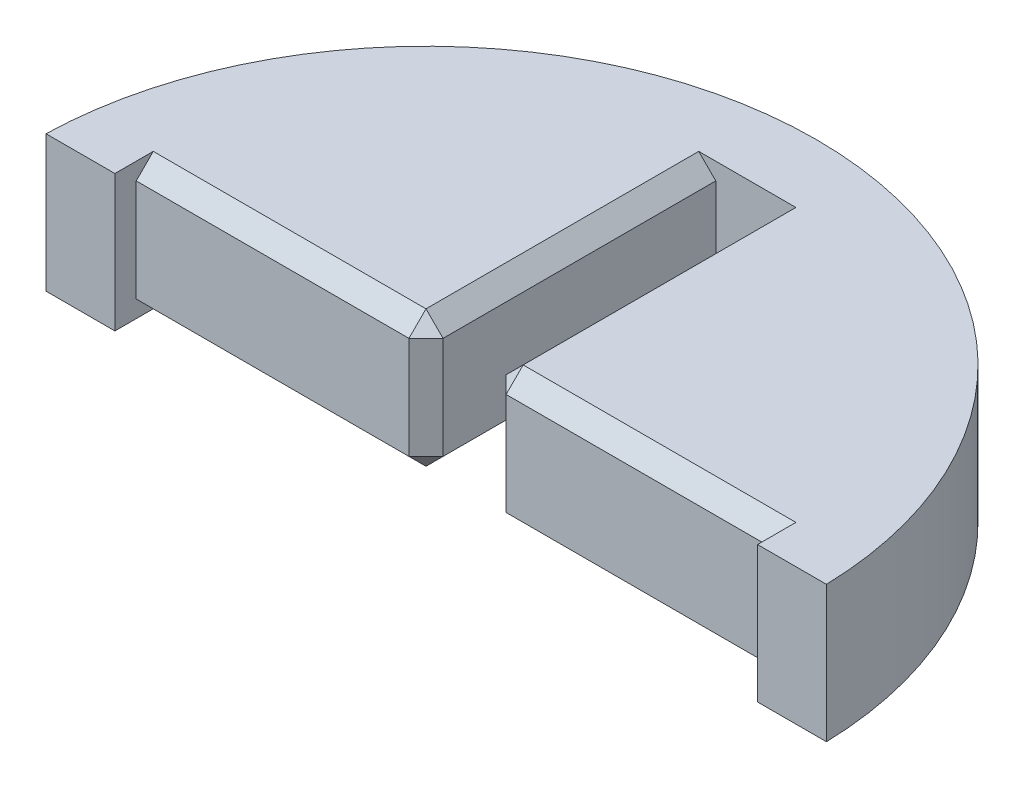
ISO-10303-21;
HEADER;
FILE_DESCRIPTION(('STEP AP214'),'2;1');
FILE_NAME('part.step','',(''),(''),'','','');
FILE_SCHEMA(('AUTOMOTIVE_DESIGN { 1 0 10303 214 1 1 1 1 }'));
ENDSEC;
DATA;
#1=APPLICATION_CONTEXT('core data for automotive mechanical design processes');
#2=APPLICATION_PROTOCOL_DEFINITION('international standard','automotive_design',2000,#1);
#3=PRODUCT_CONTEXT('',#1,'mechanical');
#4=PRODUCT('Part','Part','',(#3));
#5=PRODUCT_RELATED_PRODUCT_CATEGORY('part','',(#4));
#6=PRODUCT_DEFINITION_FORMATION('','',#4);
#7=PRODUCT_DEFINITION_CONTEXT('part definition',#1,'design');
#8=PRODUCT_DEFINITION('design','',#6,#7);
#9=PRODUCT_DEFINITION_SHAPE('','',#8);
#10=(LENGTH_UNIT() NAMED_UNIT(*) SI_UNIT(.MILLI.,.METRE.));
#11=(NAMED_UNIT(*) PLANE_ANGLE_UNIT() SI_UNIT($,.RADIAN.));
#12=(NAMED_UNIT(*) SI_UNIT($,.STERADIAN.) SOLID_ANGLE_UNIT());
#13=UNCERTAINTY_MEASURE_WITH_UNIT(LENGTH_MEASURE(1.E-05),#10,'distance_accuracy_value','');
#14=(GEOMETRIC_REPRESENTATION_CONTEXT(3) GLOBAL_UNCERTAINTY_ASSIGNED_CONTEXT((#13)) GLOBAL_UNIT_ASSIGNED_CONTEXT((#10,
#11,#12)) REPRESENTATION_CONTEXT('',''));
#15=CARTESIAN_POINT('',(0.,0.,0.));
#16=DIRECTION('',(0.,0.,1.));
#17=DIRECTION('',(1.,0.,0.));
#18=AXIS2_PLACEMENT_3D('',#15,#16,#17);
#19=CARTESIAN_POINT('',(-9.425,-1.,-0.299999999999999));
#20=DIRECTION('',(0.,0.,1.));
#21=DIRECTION('',(1.,0.,0.));
#22=AXIS2_PLACEMENT_3D('',#19,#20,#21);
#23=PLANE('',#22);
#24=DIRECTION('',(0.,1.,0.));
#25=VECTOR('',#24,1.);
#26=CARTESIAN_POINT('',(-9.425,-1.,-0.299999999999999));
#27=LINE('',#26,#25);
#28=CARTESIAN_POINT('',(-9.425,-1.,-0.299999999999999));
#29=VERTEX_POINT('',#28);
#30=CARTESIAN_POINT('',(-9.425,3.,-0.299999999999999));
#31=VERTEX_POINT('',#30);
#32=EDGE_CURVE('E212',#29,#31,#27,.T.);
#33=ORIENTED_EDGE('',*,*,#32,.T.);
#34=DIRECTION('',(1.,0.,0.));
#35=VECTOR('',#34,1.);
#36=CARTESIAN_POINT('',(-9.425,3.,-0.299999999999999));
#37=LINE('',#36,#35);
#38=CARTESIAN_POINT('',(-11.4461695884233,3.,-0.299999999999998));
#39=VERTEX_POINT('',#38);
#40=EDGE_CURVE('E185',#39,#31,#37,.T.);
#41=ORIENTED_EDGE('',*,*,#40,.F.);
#42=DIRECTION('',(0.,1.,0.));
#43=VECTOR('',#42,1.);
#44=CARTESIAN_POINT('',(-11.4461695884233,-1.,-0.299999999999998));
#45=LINE('',#44,#43);
#46=CARTESIAN_POINT('',(-11.4461695884233,-1.,-0.299999999999998));
#47=VERTEX_POINT('',#46);
#48=EDGE_CURVE('E176',#47,#39,#45,.T.);
#49=ORIENTED_EDGE('',*,*,#48,.F.);
#50=DIRECTION('',(1.,0.,0.));
#51=VECTOR('',#50,1.);
#52=CARTESIAN_POINT('',(-9.425,-1.,-0.299999999999999));
#53=LINE('',#52,#51);
#54=EDGE_CURVE('E191',#47,#29,#53,.T.);
#55=ORIENTED_EDGE('',*,*,#54,.T.);
#56=EDGE_LOOP('',(#33,#41,#49,#55));
#57=FACE_BOUND('',#56,.T.);
#58=ADVANCED_FACE('F37',(#57),#23,.T.);
#59=CARTESIAN_POINT('',(0.,-1.,0.));
#60=DIRECTION('',(0.,1.,0.));
#61=DIRECTION('',(0.,0.,1.));
#62=AXIS2_PLACEMENT_3D('',#59,#60,#61);
#63=CYLINDRICAL_SURFACE('',#62,11.4501003596888);
#64=ORIENTED_EDGE('',*,*,#48,.T.);
#65=CARTESIAN_POINT('',(0.,3.,0.));
#66=DIRECTION('',(0.,1.,0.));
#67=DIRECTION('',(0.,0.,1.));
#68=AXIS2_PLACEMENT_3D('',#65,#66,#67);
#69=CIRCLE('',#68,11.4501003596888);
#70=CARTESIAN_POINT('',(11.4461695884233,3.,-0.3));
#71=VERTEX_POINT('',#70);
#72=EDGE_CURVE('E180',#71,#39,#69,.T.);
#73=ORIENTED_EDGE('',*,*,#72,.F.);
#74=DIRECTION('',(0.,1.,0.));
#75=VECTOR('',#74,1.);
#76=CARTESIAN_POINT('',(11.4461695884233,-1.,-0.3));
#77=LINE('',#76,#75);
#78=CARTESIAN_POINT('',(11.4461695884233,-1.,-0.3));
#79=VERTEX_POINT('',#78);
#80=EDGE_CURVE('E165',#79,#71,#77,.T.);
#81=ORIENTED_EDGE('',*,*,#80,.F.);
#82=CARTESIAN_POINT('',(0.,-1.,0.));
#83=DIRECTION('',(0.,1.,0.));
#84=DIRECTION('',(0.,0.,-1.));
#85=AXIS2_PLACEMENT_3D('',#82,#83,#84);
#86=CIRCLE('',#85,11.4501003596888);
#87=EDGE_CURVE('E210',#79,#47,#86,.T.);
#88=ORIENTED_EDGE('',*,*,#87,.T.);
#89=EDGE_LOOP('',(#64,#73,#81,#88));
#90=FACE_BOUND('',#89,.T.);
#91=ADVANCED_FACE('F181',(#90),#63,.T.);
#92=CARTESIAN_POINT('',(9.425,-1.,-0.299999999999999));
#93=DIRECTION('',(0.,0.,1.));
#94=DIRECTION('',(1.,0.,0.));
#95=AXIS2_PLACEMENT_3D('',#92,#93,#94);
#96=PLANE('',#95);
#97=ORIENTED_EDGE('',*,*,#80,.T.);
#98=DIRECTION('',(1.,0.,0.));
#99=VECTOR('',#98,1.);
#100=CARTESIAN_POINT('',(9.425,3.,-0.299999999999999));
#101=LINE('',#100,#99);
#102=CARTESIAN_POINT('',(9.425,3.,-0.299999999999999));
#103=VERTEX_POINT('',#102);
#104=EDGE_CURVE('E169',#103,#71,#101,.T.);
#105=ORIENTED_EDGE('',*,*,#104,.F.);
#106=DIRECTION('',(0.,1.,0.));
#107=VECTOR('',#106,1.);
#108=CARTESIAN_POINT('',(9.425,-1.,-0.299999999999999));
#109=LINE('',#108,#107);
#110=CARTESIAN_POINT('',(9.425,-1.,-0.299999999999999));
#111=VERTEX_POINT('',#110);
#112=EDGE_CURVE('E177',#111,#103,#109,.T.);
#113=ORIENTED_EDGE('',*,*,#112,.F.);
#114=DIRECTION('',(1.,0.,0.));
#115=VECTOR('',#114,1.);
#116=CARTESIAN_POINT('',(9.425,-1.,-0.299999999999999));
#117=LINE('',#116,#115);
#118=EDGE_CURVE('E172',#111,#79,#117,.T.);
#119=ORIENTED_EDGE('',*,*,#118,.T.);
#120=EDGE_LOOP('',(#97,#105,#113,#119));
#121=FACE_BOUND('',#120,.T.);
#122=ADVANCED_FACE('F167',(#121),#96,.T.);
#123=CARTESIAN_POINT('',(9.425,-1.,-0.925000000000001));
#124=DIRECTION('',(-1.,0.,0.));
#125=DIRECTION('',(0.,0.,1.));
#126=AXIS2_PLACEMENT_3D('',#123,#124,#125);
#127=PLANE('',#126);
#128=ORIENTED_EDGE('',*,*,#112,.T.);
#129=DIRECTION('',(0.,0.,1.));
#130=VECTOR('',#129,1.);
#131=CARTESIAN_POINT('',(9.425,3.,-0.925000000000001));
#132=LINE('',#131,#130);
#133=CARTESIAN_POINT('',(9.425,3.,-1.425));
#134=VERTEX_POINT('',#133);
#135=EDGE_CURVE('E190',#134,#103,#132,.T.);
#136=ORIENTED_EDGE('',*,*,#135,.F.);
#137=DIRECTION('',(0.,0.707106781186548,-0.707106781186548));
#138=VECTOR('',#137,1.);
#139=CARTESIAN_POINT('',(9.425,3.,-1.425));
#140=LINE('',#139,#138);
#141=CARTESIAN_POINT('',(9.425,2.5,-0.925000000000001));
#142=VERTEX_POINT('',#141);
#143=EDGE_CURVE('E275',#134,#142,#140,.F.);
#144=ORIENTED_EDGE('',*,*,#143,.T.);
#145=DIRECTION('',(0.,1.,0.));
#146=VECTOR('',#145,1.);
#147=CARTESIAN_POINT('',(9.425,-1.,-0.925000000000001));
#148=LINE('',#147,#146);
#149=CARTESIAN_POINT('',(9.425,-0.499999999999996,-0.925000000000001));
#150=VERTEX_POINT('',#149);
#151=EDGE_CURVE('E216',#150,#142,#148,.T.);
#152=ORIENTED_EDGE('',*,*,#151,.F.);
#153=DIRECTION('',(0.,0.707106781186548,0.707106781186548));
#154=VECTOR('',#153,1.);
#155=CARTESIAN_POINT('',(9.425,-0.499999999999996,-0.925000000000001));
#156=LINE('',#155,#154);
#157=CARTESIAN_POINT('',(9.425,-1.,-1.425));
#158=VERTEX_POINT('',#157);
#159=EDGE_CURVE('E270',#150,#158,#156,.F.);
#160=ORIENTED_EDGE('',*,*,#159,.T.);
#161=DIRECTION('',(0.,0.,1.));
#162=VECTOR('',#161,1.);
#163=CARTESIAN_POINT('',(9.425,-1.,-0.925000000000001));
#164=LINE('',#163,#162);
#165=EDGE_CURVE('E206',#158,#111,#164,.T.);
#166=ORIENTED_EDGE('',*,*,#165,.T.);
#167=EDGE_LOOP('',(#128,#136,#144,#152,#160,#166));
#168=FACE_BOUND('',#167,.T.);
#169=ADVANCED_FACE('F542',(#168),#127,.T.);
#170=CARTESIAN_POINT('',(0.925000000000001,-1.,-0.925000000000001));
#171=DIRECTION('',(0.,0.,1.));
#172=DIRECTION('',(1.,0.,0.));
#173=AXIS2_PLACEMENT_3D('',#170,#171,#172);
#174=PLANE('',#173);
#175=DIRECTION('',(0.,-1.,0.));
#176=VECTOR('',#175,1.);
#177=CARTESIAN_POINT('',(1.425,-1.,-0.925000000000001));
#178=LINE('',#177,#176);
#179=CARTESIAN_POINT('',(1.425,2.5,-0.925000000000001));
#180=VERTEX_POINT('',#179);
#181=CARTESIAN_POINT('',(1.425,-0.499999999999996,-0.925000000000001));
#182=VERTEX_POINT('',#181);
#183=EDGE_CURVE('E229',#180,#182,#178,.T.);
#184=ORIENTED_EDGE('',*,*,#183,.T.);
#185=DIRECTION('',(1.,0.,0.));
#186=VECTOR('',#185,1.);
#187=CARTESIAN_POINT('',(0.925000000000001,-0.499999999999996,-0.925000000000001));
#188=LINE('',#187,#186);
#189=EDGE_CURVE('E231',#182,#150,#188,.T.);
#190=ORIENTED_EDGE('',*,*,#189,.T.);
#191=ORIENTED_EDGE('',*,*,#151,.T.);
#192=DIRECTION('',(-1.,0.,0.));
#193=VECTOR('',#192,1.);
#194=CARTESIAN_POINT('',(0.925000000000001,2.5,-0.925000000000001));
#195=LINE('',#194,#193);
#196=EDGE_CURVE('E213',#142,#180,#195,.T.);
#197=ORIENTED_EDGE('',*,*,#196,.T.);
#198=EDGE_LOOP('',(#184,#190,#191,#197));
#199=FACE_BOUND('',#198,.T.);
#200=ADVANCED_FACE('F532',(#199),#174,.T.);
#201=CARTESIAN_POINT('',(0.925,-1.,-9.425));
#202=DIRECTION('',(-1.,0.,0.));
#203=DIRECTION('',(0.,0.,1.));
#204=AXIS2_PLACEMENT_3D('',#201,#202,#203);
#205=PLANE('',#204);
#206=DIRECTION('',(0.,1.,0.));
#207=VECTOR('',#206,1.);
#208=CARTESIAN_POINT('',(0.925,-1.,-9.425));
#209=LINE('',#208,#207);
#210=CARTESIAN_POINT('',(0.925,-0.499999999999996,-9.425));
#211=VERTEX_POINT('',#210);
#212=CARTESIAN_POINT('',(0.925,2.5,-9.425));
#213=VERTEX_POINT('',#212);
#214=EDGE_CURVE('E219',#211,#213,#209,.T.);
#215=ORIENTED_EDGE('',*,*,#214,.F.);
#216=DIRECTION('',(0.,0.,1.));
#217=VECTOR('',#216,1.);
#218=CARTESIAN_POINT('',(0.925,-0.499999999999996,-9.425));
#219=LINE('',#218,#217);
#220=CARTESIAN_POINT('',(0.925000000000001,-0.499999999999996,-1.425));
#221=VERTEX_POINT('',#220);
#222=EDGE_CURVE('E248',#211,#221,#219,.T.);
#223=ORIENTED_EDGE('',*,*,#222,.T.);
#224=DIRECTION('',(0.,1.,0.));
#225=VECTOR('',#224,1.);
#226=CARTESIAN_POINT('',(0.925000000000001,-1.,-1.425));
#227=LINE('',#226,#225);
#228=CARTESIAN_POINT('',(0.925000000000001,2.5,-1.425));
#229=VERTEX_POINT('',#228);
#230=EDGE_CURVE('E246',#221,#229,#227,.T.);
#231=ORIENTED_EDGE('',*,*,#230,.T.);
#232=DIRECTION('',(0.,0.,-1.));
#233=VECTOR('',#232,1.);
#234=CARTESIAN_POINT('',(0.925,2.5,-9.425));
#235=LINE('',#234,#233);
#236=EDGE_CURVE('E244',#229,#213,#235,.T.);
#237=ORIENTED_EDGE('',*,*,#236,.T.);
#238=EDGE_LOOP('',(#215,#223,#231,#237));
#239=FACE_BOUND('',#238,.T.);
#240=ADVANCED_FACE('F522',(#239),#205,.T.);
#241=CARTESIAN_POINT('',(0.,-1.,-9.425));
#242=DIRECTION('',(0.,0.,1.));
#243=DIRECTION('',(1.,0.,0.));
#244=AXIS2_PLACEMENT_3D('',#241,#242,#243);
#245=PLANE('',#244);
#246=DIRECTION('',(1.,0.,0.));
#247=VECTOR('',#246,1.);
#248=CARTESIAN_POINT('',(-0.925,-1.,-9.425));
#249=LINE('',#248,#247);
#250=CARTESIAN_POINT('',(-1.425,-1.,-9.425));
#251=VERTEX_POINT('',#250);
#252=CARTESIAN_POINT('',(1.425,-1.,-9.425));
#253=VERTEX_POINT('',#252);
#254=EDGE_CURVE('E204',#251,#253,#249,.T.);
#255=ORIENTED_EDGE('',*,*,#254,.T.);
#256=DIRECTION('',(0.707106781186548,-0.707106781186548,0.));
#257=VECTOR('',#256,1.);
#258=CARTESIAN_POINT('',(0.925,-0.499999999999996,-9.425));
#259=LINE('',#258,#257);
#260=EDGE_CURVE('E273',#253,#211,#259,.F.);
#261=ORIENTED_EDGE('',*,*,#260,.T.);
#262=ORIENTED_EDGE('',*,*,#214,.T.);
#263=DIRECTION('',(-0.707106781186548,-0.707106781186548,0.));
#264=VECTOR('',#263,1.);
#265=CARTESIAN_POINT('',(1.425,3.,-9.425));
#266=LINE('',#265,#264);
#267=CARTESIAN_POINT('',(1.425,3.,-9.425));
#268=VERTEX_POINT('',#267);
#269=EDGE_CURVE('E277',#213,#268,#266,.F.);
#270=ORIENTED_EDGE('',*,*,#269,.T.);
#271=DIRECTION('',(1.,0.,0.));
#272=VECTOR('',#271,1.);
#273=CARTESIAN_POINT('',(0.,3.,-9.425));
#274=LINE('',#273,#272);
#275=CARTESIAN_POINT('',(-1.425,3.,-9.425));
#276=VERTEX_POINT('',#275);
#277=EDGE_CURVE('E196',#276,#268,#274,.T.);
#278=ORIENTED_EDGE('',*,*,#277,.F.);
#279=DIRECTION('',(-0.707106781186548,0.707106781186548,0.));
#280=VECTOR('',#279,1.);
#281=CARTESIAN_POINT('',(-1.425,3.,-9.425));
#282=LINE('',#281,#280);
#283=CARTESIAN_POINT('',(-0.925,2.5,-9.425));
#284=VERTEX_POINT('',#283);
#285=EDGE_CURVE('E47',#276,#284,#282,.F.);
#286=ORIENTED_EDGE('',*,*,#285,.T.);
#287=DIRECTION('',(0.,1.,0.));
#288=VECTOR('',#287,1.);
#289=CARTESIAN_POINT('',(-0.925,-1.,-9.425));
#290=LINE('',#289,#288);
#291=CARTESIAN_POINT('',(-0.925,-0.5,-9.425));
#292=VERTEX_POINT('',#291);
#293=EDGE_CURVE('E222',#292,#284,#290,.T.);
#294=ORIENTED_EDGE('',*,*,#293,.F.);
#295=DIRECTION('',(0.707106781186548,0.707106781186548,0.));
#296=VECTOR('',#295,1.);
#297=CARTESIAN_POINT('',(-0.925,-0.5,-9.425));
#298=LINE('',#297,#296);
#299=EDGE_CURVE('E282',#292,#251,#298,.F.);
#300=ORIENTED_EDGE('',*,*,#299,.T.);
#301=EDGE_LOOP('',(#255,#261,#262,#270,#278,#286,#294,#300));
#302=FACE_BOUND('',#301,.T.);
#303=ADVANCED_FACE('F348',(#302),#245,.T.);
#304=CARTESIAN_POINT('',(-0.925,-1.,-0.925000000000001));
#305=DIRECTION('',(1.,0.,0.));
#306=DIRECTION('',(0.,0.,-1.));
#307=AXIS2_PLACEMENT_3D('',#304,#305,#306);
#308=PLANE('',#307);
#309=DIRECTION('',(0.,-1.,0.));
#310=VECTOR('',#309,1.);
#311=CARTESIAN_POINT('',(-0.925,-1.,-1.425));
#312=LINE('',#311,#310);
#313=CARTESIAN_POINT('',(-0.925,2.5,-1.425));
#314=VERTEX_POINT('',#313);
#315=CARTESIAN_POINT('',(-0.925,-0.5,-1.425));
#316=VERTEX_POINT('',#315);
#317=EDGE_CURVE('E55',#314,#316,#312,.T.);
#318=ORIENTED_EDGE('',*,*,#317,.T.);
#319=DIRECTION('',(0.,0.,-1.));
#320=VECTOR('',#319,1.);
#321=CARTESIAN_POINT('',(-0.925,-0.5,-0.925000000000001));
#322=LINE('',#321,#320);
#323=EDGE_CURVE('E268',#316,#292,#322,.T.);
#324=ORIENTED_EDGE('',*,*,#323,.T.);
#325=ORIENTED_EDGE('',*,*,#293,.T.);
#326=DIRECTION('',(0.,0.,1.));
#327=VECTOR('',#326,1.);
#328=CARTESIAN_POINT('',(-0.925,2.5,-0.925000000000001));
#329=LINE('',#328,#327);
#330=EDGE_CURVE('E60',#284,#314,#329,.T.);
#331=ORIENTED_EDGE('',*,*,#330,.T.);
#332=EDGE_LOOP('',(#318,#324,#325,#331));
#333=FACE_BOUND('',#332,.T.);
#334=ADVANCED_FACE('F350',(#333),#308,.T.);
#335=CARTESIAN_POINT('',(-9.425,-1.,-0.925000000000001));
#336=DIRECTION('',(0.,0.,1.));
#337=DIRECTION('',(1.,0.,0.));
#338=AXIS2_PLACEMENT_3D('',#335,#336,#337);
#339=PLANE('',#338);
#340=DIRECTION('',(0.,1.,0.));
#341=VECTOR('',#340,1.);
#342=CARTESIAN_POINT('',(-9.425,-1.,-0.925000000000001));
#343=LINE('',#342,#341);
#344=CARTESIAN_POINT('',(-9.425,-0.5,-0.925000000000001));
#345=VERTEX_POINT('',#344);
#346=CARTESIAN_POINT('',(-9.425,2.5,-0.925000000000001));
#347=VERTEX_POINT('',#346);
#348=EDGE_CURVE('E224',#345,#347,#343,.T.);
#349=ORIENTED_EDGE('',*,*,#348,.F.);
#350=DIRECTION('',(1.,0.,0.));
#351=VECTOR('',#350,1.);
#352=CARTESIAN_POINT('',(-9.425,-0.5,-0.925000000000001));
#353=LINE('',#352,#351);
#354=CARTESIAN_POINT('',(-1.425,-0.5,-0.925000000000001));
#355=VERTEX_POINT('',#354);
#356=EDGE_CURVE('E263',#345,#355,#353,.T.);
#357=ORIENTED_EDGE('',*,*,#356,.T.);
#358=DIRECTION('',(0.,1.,0.));
#359=VECTOR('',#358,1.);
#360=CARTESIAN_POINT('',(-1.425,-1.,-0.925000000000001));
#361=LINE('',#360,#359);
#362=CARTESIAN_POINT('',(-1.425,2.5,-0.925000000000001));
#363=VERTEX_POINT('',#362);
#364=EDGE_CURVE('E261',#355,#363,#361,.T.);
#365=ORIENTED_EDGE('',*,*,#364,.T.);
#366=DIRECTION('',(-1.,0.,0.));
#367=VECTOR('',#366,1.);
#368=CARTESIAN_POINT('',(-9.425,2.5,-0.925000000000001));
#369=LINE('',#368,#367);
#370=EDGE_CURVE('E259',#363,#347,#369,.T.);
#371=ORIENTED_EDGE('',*,*,#370,.T.);
#372=EDGE_LOOP('',(#349,#357,#365,#371));
#373=FACE_BOUND('',#372,.T.);
#374=ADVANCED_FACE('F360',(#373),#339,.T.);
#375=CARTESIAN_POINT('',(-9.425,-1.,-0.299999999999999));
#376=DIRECTION('',(1.,0.,0.));
#377=DIRECTION('',(0.,0.,-1.));
#378=AXIS2_PLACEMENT_3D('',#375,#376,#377);
#379=PLANE('',#378);
#380=DIRECTION('',(0.,0.,-1.));
#381=VECTOR('',#380,1.);
#382=CARTESIAN_POINT('',(-9.425,-1.,-0.299999999999999));
#383=LINE('',#382,#381);
#384=CARTESIAN_POINT('',(-9.425,-1.,-1.425));
#385=VERTEX_POINT('',#384);
#386=EDGE_CURVE('E194',#29,#385,#383,.T.);
#387=ORIENTED_EDGE('',*,*,#386,.T.);
#388=DIRECTION('',(0.,-0.707106781186548,-0.707106781186548));
#389=VECTOR('',#388,1.);
#390=CARTESIAN_POINT('',(-9.425,-0.5,-0.925000000000001));
#391=LINE('',#390,#389);
#392=EDGE_CURVE('E280',#385,#345,#391,.F.);
#393=ORIENTED_EDGE('',*,*,#392,.T.);
#394=ORIENTED_EDGE('',*,*,#348,.T.);
#395=DIRECTION('',(0.,-0.707106781186548,0.707106781186548));
#396=VECTOR('',#395,1.);
#397=CARTESIAN_POINT('',(-9.425,3.,-1.425));
#398=LINE('',#397,#396);
#399=CARTESIAN_POINT('',(-9.425,3.,-1.425));
#400=VERTEX_POINT('',#399);
#401=EDGE_CURVE('E11',#347,#400,#398,.F.);
#402=ORIENTED_EDGE('',*,*,#401,.T.);
#403=DIRECTION('',(0.,0.,-1.));
#404=VECTOR('',#403,1.);
#405=CARTESIAN_POINT('',(-9.425,3.,-0.299999999999999));
#406=LINE('',#405,#404);
#407=EDGE_CURVE('E200',#31,#400,#406,.T.);
#408=ORIENTED_EDGE('',*,*,#407,.F.);
#409=ORIENTED_EDGE('',*,*,#32,.F.);
#410=EDGE_LOOP('',(#387,#393,#394,#402,#408,#409));
#411=FACE_BOUND('',#410,.T.);
#412=ADVANCED_FACE('F357',(#411),#379,.T.);
#413=CARTESIAN_POINT('',(0.,-1.,0.));
#414=DIRECTION('',(0.,-1.,0.));
#415=DIRECTION('',(0.,0.,-1.));
#416=AXIS2_PLACEMENT_3D('',#413,#414,#415);
#417=PLANE('',#416);
#418=ORIENTED_EDGE('',*,*,#165,.F.);
#419=DIRECTION('',(-1.,0.,0.));
#420=VECTOR('',#419,1.);
#421=CARTESIAN_POINT('',(0.,-1.,-1.425));
#422=LINE('',#421,#420);
#423=CARTESIAN_POINT('',(1.425,-1.,-1.425));
#424=VERTEX_POINT('',#423);
#425=EDGE_CURVE('E242',#158,#424,#422,.T.);
#426=ORIENTED_EDGE('',*,*,#425,.T.);
#427=DIRECTION('',(0.,0.,-1.));
#428=VECTOR('',#427,1.);
#429=CARTESIAN_POINT('',(1.42500000000001,-1.,0.));
#430=LINE('',#429,#428);
#431=EDGE_CURVE('E239',#424,#253,#430,.T.);
#432=ORIENTED_EDGE('',*,*,#431,.T.);
#433=ORIENTED_EDGE('',*,*,#254,.F.);
#434=DIRECTION('',(0.,0.,1.));
#435=VECTOR('',#434,1.);
#436=CARTESIAN_POINT('',(-1.425,-1.,0.));
#437=LINE('',#436,#435);
#438=CARTESIAN_POINT('',(-1.425,-1.,-1.425));
#439=VERTEX_POINT('',#438);
#440=EDGE_CURVE('E234',#251,#439,#437,.T.);
#441=ORIENTED_EDGE('',*,*,#440,.T.);
#442=DIRECTION('',(-1.,0.,0.));
#443=VECTOR('',#442,1.);
#444=CARTESIAN_POINT('',(0.,-1.,-1.425));
#445=LINE('',#444,#443);
#446=EDGE_CURVE('E236',#439,#385,#445,.T.);
#447=ORIENTED_EDGE('',*,*,#446,.T.);
#448=ORIENTED_EDGE('',*,*,#386,.F.);
#449=ORIENTED_EDGE('',*,*,#54,.F.);
#450=ORIENTED_EDGE('',*,*,#87,.F.);
#451=ORIENTED_EDGE('',*,*,#118,.F.);
#452=EDGE_LOOP('',(#418,#426,#432,#433,#441,#447,#448,#449,#450,#451));
#453=FACE_BOUND('',#452,.T.);
#454=ADVANCED_FACE('F342',(#453),#417,.T.);
#455=CARTESIAN_POINT('',(0.,3.,0.));
#456=DIRECTION('',(0.,1.,0.));
#457=DIRECTION('',(-0.2579209826933,0.,0.966166014040301));
#458=AXIS2_PLACEMENT_3D('',#455,#456,#457);
#459=PLANE('',#458);
#460=DIRECTION('',(1.,0.,0.));
#461=VECTOR('',#460,1.);
#462=CARTESIAN_POINT('',(0.,3.,-1.425));
#463=LINE('',#462,#461);
#464=CARTESIAN_POINT('',(1.42500000000001,3.,-1.425));
#465=VERTEX_POINT('',#464);
#466=EDGE_CURVE('E257',#465,#134,#463,.T.);
#467=ORIENTED_EDGE('',*,*,#466,.T.);
#468=ORIENTED_EDGE('',*,*,#135,.T.);
#469=ORIENTED_EDGE('',*,*,#104,.T.);
#470=ORIENTED_EDGE('',*,*,#72,.T.);
#471=ORIENTED_EDGE('',*,*,#40,.T.);
#472=ORIENTED_EDGE('',*,*,#407,.T.);
#473=DIRECTION('',(1.,0.,0.));
#474=VECTOR('',#473,1.);
#475=CARTESIAN_POINT('',(0.,3.,-1.425));
#476=LINE('',#475,#474);
#477=CARTESIAN_POINT('',(-1.425,3.,-1.425));
#478=VERTEX_POINT('',#477);
#479=EDGE_CURVE('E250',#400,#478,#476,.T.);
#480=ORIENTED_EDGE('',*,*,#479,.T.);
#481=DIRECTION('',(0.,0.,-1.));
#482=VECTOR('',#481,1.);
#483=CARTESIAN_POINT('',(-1.425,3.,0.));
#484=LINE('',#483,#482);
#485=EDGE_CURVE('E252',#478,#276,#484,.T.);
#486=ORIENTED_EDGE('',*,*,#485,.T.);
#487=ORIENTED_EDGE('',*,*,#277,.T.);
#488=DIRECTION('',(0.,0.,1.));
#489=VECTOR('',#488,1.);
#490=CARTESIAN_POINT('',(1.42500000000001,3.,0.));
#491=LINE('',#490,#489);
#492=EDGE_CURVE('E255',#268,#465,#491,.T.);
#493=ORIENTED_EDGE('',*,*,#492,.T.);
#494=EDGE_LOOP('',(#467,#468,#469,#470,#471,#472,#480,#486,#487,#493));
#495=FACE_BOUND('',#494,.T.);
#496=ADVANCED_FACE('F189',(#495),#459,.T.);
#497=CARTESIAN_POINT('',(1.42500000000001,3.,0.));
#498=DIRECTION('',(0.707106781186547,-0.707106781186547,0.));
#499=DIRECTION('',(0.,0.,1.));
#500=AXIS2_PLACEMENT_3D('',#497,#498,#499);
#501=PLANE('',#500);
#502=ORIENTED_EDGE('',*,*,#269,.F.);
#503=ORIENTED_EDGE('',*,*,#236,.F.);
#504=DIRECTION('',(0.707106781186547,0.707106781186547,0.));
#505=VECTOR('',#504,1.);
#506=CARTESIAN_POINT('',(0.925000000000001,2.5,-1.425));
#507=LINE('',#506,#505);
#508=EDGE_CURVE('E186',#465,#229,#507,.F.);
#509=ORIENTED_EDGE('',*,*,#508,.F.);
#510=ORIENTED_EDGE('',*,*,#492,.F.);
#511=EDGE_LOOP('',(#502,#503,#509,#510));
#512=FACE_BOUND('',#511,.T.);
#513=ADVANCED_FACE('F419',(#512),#501,.F.);
#514=CARTESIAN_POINT('',(0.,3.,-1.425));
#515=DIRECTION('',(0.,-0.707106781186547,-0.707106781186547));
#516=DIRECTION('',(1.,0.,0.));
#517=AXIS2_PLACEMENT_3D('',#514,#515,#516);
#518=PLANE('',#517);
#519=ORIENTED_EDGE('',*,*,#143,.F.);
#520=ORIENTED_EDGE('',*,*,#466,.F.);
#521=DIRECTION('',(0.,-0.707106781186548,0.707106781186548));
#522=VECTOR('',#521,1.);
#523=CARTESIAN_POINT('',(1.425,2.75,-1.175));
#524=LINE('',#523,#522);
#525=EDGE_CURVE('E298',#180,#465,#524,.F.);
#526=ORIENTED_EDGE('',*,*,#525,.F.);
#527=ORIENTED_EDGE('',*,*,#196,.F.);
#528=EDGE_LOOP('',(#519,#520,#526,#527));
#529=FACE_BOUND('',#528,.T.);
#530=ADVANCED_FACE('F412',(#529),#518,.F.);
#531=CARTESIAN_POINT('',(0.925000000000001,2.5,-1.425));
#532=DIRECTION('',(-0.577350269189625,0.577350269189626,0.577350269189626));
#533=DIRECTION('',(0.,-0.707106781186547,0.707106781186548));
#534=AXIS2_PLACEMENT_3D('',#531,#532,#533);
#535=PLANE('',#534);
#536=ORIENTED_EDGE('',*,*,#525,.T.);
#537=ORIENTED_EDGE('',*,*,#508,.T.);
#538=DIRECTION('',(-0.707106781186548,0.,-0.707106781186547));
#539=VECTOR('',#538,1.);
#540=CARTESIAN_POINT('',(0.925000000000001,2.5,-1.425));
#541=LINE('',#540,#539);
#542=EDGE_CURVE('E295',#180,#229,#541,.T.);
#543=ORIENTED_EDGE('',*,*,#542,.F.);
#544=EDGE_LOOP('',(#536,#537,#543));
#545=FACE_BOUND('',#544,.T.);
#546=ADVANCED_FACE('F405',(#545),#535,.T.);
#547=CARTESIAN_POINT('',(0.925,-0.499999999999996,-9.425));
#548=DIRECTION('',(0.707106781186547,0.707106781186547,0.));
#549=DIRECTION('',(0.,0.,1.));
#550=AXIS2_PLACEMENT_3D('',#547,#548,#549);
#551=PLANE('',#550);
#552=ORIENTED_EDGE('',*,*,#260,.F.);
#553=ORIENTED_EDGE('',*,*,#431,.F.);
#554=DIRECTION('',(-0.707106781186547,0.707106781186547,0.));
#555=VECTOR('',#554,1.);
#556=CARTESIAN_POINT('',(1.425,-1.,-1.425));
#557=LINE('',#556,#555);
#558=EDGE_CURVE('E292',#221,#424,#557,.F.);
#559=ORIENTED_EDGE('',*,*,#558,.F.);
#560=ORIENTED_EDGE('',*,*,#222,.F.);
#561=EDGE_LOOP('',(#552,#553,#559,#560));
#562=FACE_BOUND('',#561,.T.);
#563=ADVANCED_FACE('F398',(#562),#551,.F.);
#564=CARTESIAN_POINT('',(0.925000000000001,-1.,-1.425));
#565=DIRECTION('',(0.707106781186547,0.,-0.707106781186548));
#566=DIRECTION('',(0.,1.,0.));
#567=AXIS2_PLACEMENT_3D('',#564,#565,#566);
#568=PLANE('',#567);
#569=ORIENTED_EDGE('',*,*,#542,.T.);
#570=ORIENTED_EDGE('',*,*,#230,.F.);
#571=DIRECTION('',(0.707106781186548,0.,0.707106781186547));
#572=VECTOR('',#571,1.);
#573=CARTESIAN_POINT('',(1.175,-0.499999999999996,-1.175));
#574=LINE('',#573,#572);
#575=EDGE_CURVE('E289',#182,#221,#574,.F.);
#576=ORIENTED_EDGE('',*,*,#575,.F.);
#577=ORIENTED_EDGE('',*,*,#183,.F.);
#578=EDGE_LOOP('',(#569,#570,#576,#577));
#579=FACE_BOUND('',#578,.T.);
#580=ADVANCED_FACE('F391',(#579),#568,.F.);
#581=CARTESIAN_POINT('',(1.425,-1.,-1.425));
#582=DIRECTION('',(-0.577350269189625,-0.577350269189626,0.577350269189626));
#583=DIRECTION('',(0.,-0.707106781186547,-0.707106781186548));
#584=AXIS2_PLACEMENT_3D('',#581,#582,#583);
#585=PLANE('',#584);
#586=ORIENTED_EDGE('',*,*,#575,.T.);
#587=ORIENTED_EDGE('',*,*,#558,.T.);
#588=DIRECTION('',(0.,-0.707106781186547,-0.707106781186547));
#589=VECTOR('',#588,1.);
#590=CARTESIAN_POINT('',(1.425,-1.,-1.425));
#591=LINE('',#590,#589);
#592=EDGE_CURVE('E286',#182,#424,#591,.T.);
#593=ORIENTED_EDGE('',*,*,#592,.F.);
#594=EDGE_LOOP('',(#586,#587,#593));
#595=FACE_BOUND('',#594,.T.);
#596=ADVANCED_FACE('F384',(#595),#585,.T.);
#597=CARTESIAN_POINT('',(0.925000000000001,-0.499999999999996,-0.925000000000001));
#598=DIRECTION('',(0.,0.707106781186547,-0.707106781186547));
#599=DIRECTION('',(1.,0.,0.));
#600=AXIS2_PLACEMENT_3D('',#597,#598,#599);
#601=PLANE('',#600);
#602=ORIENTED_EDGE('',*,*,#592,.T.);
#603=ORIENTED_EDGE('',*,*,#425,.F.);
#604=ORIENTED_EDGE('',*,*,#159,.F.);
#605=ORIENTED_EDGE('',*,*,#189,.F.);
#606=EDGE_LOOP('',(#602,#603,#604,#605));
#607=FACE_BOUND('',#606,.T.);
#608=ADVANCED_FACE('F378',(#607),#601,.F.);
#609=CARTESIAN_POINT('',(0.,3.,-1.425));
#610=DIRECTION('',(0.,-0.707106781186547,-0.707106781186547));
#611=DIRECTION('',(1.,0.,0.));
#612=AXIS2_PLACEMENT_3D('',#609,#610,#611);
#613=PLANE('',#612);
#614=ORIENTED_EDGE('',*,*,#401,.F.);
#615=ORIENTED_EDGE('',*,*,#370,.F.);
#616=DIRECTION('',(0.,0.707106781186547,-0.707106781186547));
#617=VECTOR('',#616,1.);
#618=CARTESIAN_POINT('',(-1.425,2.5,-0.925000000000001));
#619=LINE('',#618,#617);
#620=EDGE_CURVE('E42',#478,#363,#619,.F.);
#621=ORIENTED_EDGE('',*,*,#620,.F.);
#622=ORIENTED_EDGE('',*,*,#479,.F.);
#623=EDGE_LOOP('',(#614,#615,#621,#622));
#624=FACE_BOUND('',#623,.T.);
#625=ADVANCED_FACE('F40',(#624),#613,.F.);
#626=CARTESIAN_POINT('',(-1.425,3.,0.));
#627=DIRECTION('',(-0.707106781186547,-0.707106781186547,0.));
#628=DIRECTION('',(0.,0.,-1.));
#629=AXIS2_PLACEMENT_3D('',#626,#627,#628);
#630=PLANE('',#629);
#631=ORIENTED_EDGE('',*,*,#285,.F.);
#632=ORIENTED_EDGE('',*,*,#485,.F.);
#633=DIRECTION('',(0.707106781186548,-0.707106781186548,0.));
#634=VECTOR('',#633,1.);
#635=CARTESIAN_POINT('',(-1.175,2.75,-1.425));
#636=LINE('',#635,#634);
#637=EDGE_CURVE('E313',#314,#478,#636,.F.);
#638=ORIENTED_EDGE('',*,*,#637,.F.);
#639=ORIENTED_EDGE('',*,*,#330,.F.);
#640=EDGE_LOOP('',(#631,#632,#638,#639));
#641=FACE_BOUND('',#640,.T.);
#642=ADVANCED_FACE('F352',(#641),#630,.F.);
#643=CARTESIAN_POINT('',(-1.425,2.5,-0.925000000000001));
#644=DIRECTION('',(0.577350269189626,0.577350269189626,0.577350269189625));
#645=DIRECTION('',(-0.707106781186547,0.707106781186548,0.));
#646=AXIS2_PLACEMENT_3D('',#643,#644,#645);
#647=PLANE('',#646);
#648=ORIENTED_EDGE('',*,*,#637,.T.);
#649=ORIENTED_EDGE('',*,*,#620,.T.);
#650=DIRECTION('',(-0.707106781186547,0.,0.707106781186548));
#651=VECTOR('',#650,1.);
#652=CARTESIAN_POINT('',(-1.425,2.5,-0.925000000000001));
#653=LINE('',#652,#651);
#654=EDGE_CURVE('E311',#314,#363,#653,.T.);
#655=ORIENTED_EDGE('',*,*,#654,.F.);
#656=EDGE_LOOP('',(#648,#649,#655));
#657=FACE_BOUND('',#656,.T.);
#658=ADVANCED_FACE('F319',(#657),#647,.T.);
#659=CARTESIAN_POINT('',(-1.425,-1.,-0.925000000000001));
#660=DIRECTION('',(-0.707106781186548,0.,-0.707106781186547));
#661=DIRECTION('',(0.,1.,0.));
#662=AXIS2_PLACEMENT_3D('',#659,#660,#661);
#663=PLANE('',#662);
#664=ORIENTED_EDGE('',*,*,#654,.T.);
#665=ORIENTED_EDGE('',*,*,#364,.F.);
#666=DIRECTION('',(0.707106781186547,0.,-0.707106781186548));
#667=VECTOR('',#666,1.);
#668=CARTESIAN_POINT('',(-1.425,-0.5,-0.925000000000001));
#669=LINE('',#668,#667);
#670=EDGE_CURVE('E308',#316,#355,#669,.F.);
#671=ORIENTED_EDGE('',*,*,#670,.F.);
#672=ORIENTED_EDGE('',*,*,#317,.F.);
#673=EDGE_LOOP('',(#664,#665,#671,#672));
#674=FACE_BOUND('',#673,.T.);
#675=ADVANCED_FACE('F325',(#674),#663,.F.);
#676=CARTESIAN_POINT('',(-0.925,-0.5,-0.925000000000001));
#677=DIRECTION('',(-0.707106781186547,0.707106781186547,0.));
#678=DIRECTION('',(0.,0.,-1.));
#679=AXIS2_PLACEMENT_3D('',#676,#677,#678);
#680=PLANE('',#679);
#681=ORIENTED_EDGE('',*,*,#299,.F.);
#682=ORIENTED_EDGE('',*,*,#323,.F.);
#683=DIRECTION('',(-0.707106781186548,-0.707106781186548,0.));
#684=VECTOR('',#683,1.);
#685=CARTESIAN_POINT('',(-1.175,-0.749999999999999,-1.425));
#686=LINE('',#685,#684);
#687=EDGE_CURVE('E305',#439,#316,#686,.F.);
#688=ORIENTED_EDGE('',*,*,#687,.F.);
#689=ORIENTED_EDGE('',*,*,#440,.F.);
#690=EDGE_LOOP('',(#681,#682,#688,#689));
#691=FACE_BOUND('',#690,.T.);
#692=ADVANCED_FACE('F335',(#691),#680,.F.);
#693=CARTESIAN_POINT('',(-1.425,-0.5,-0.925000000000001));
#694=DIRECTION('',(0.577350269189626,-0.577350269189626,0.577350269189625));
#695=DIRECTION('',(0.707106781186547,0.707106781186548,0.));
#696=AXIS2_PLACEMENT_3D('',#693,#694,#695);
#697=PLANE('',#696);
#698=ORIENTED_EDGE('',*,*,#687,.T.);
#699=ORIENTED_EDGE('',*,*,#670,.T.);
#700=DIRECTION('',(0.,0.707106781186547,0.707106781186547));
#701=VECTOR('',#700,1.);
#702=CARTESIAN_POINT('',(-1.425,-0.5,-0.925000000000001));
#703=LINE('',#702,#701);
#704=EDGE_CURVE('E303',#439,#355,#703,.T.);
#705=ORIENTED_EDGE('',*,*,#704,.F.);
#706=EDGE_LOOP('',(#698,#699,#705));
#707=FACE_BOUND('',#706,.T.);
#708=ADVANCED_FACE('F330',(#707),#697,.T.);
#709=CARTESIAN_POINT('',(-9.425,-0.5,-0.925000000000001));
#710=DIRECTION('',(0.,0.707106781186547,-0.707106781186547));
#711=DIRECTION('',(1.,0.,0.));
#712=AXIS2_PLACEMENT_3D('',#709,#710,#711);
#713=PLANE('',#712);
#714=ORIENTED_EDGE('',*,*,#392,.F.);
#715=ORIENTED_EDGE('',*,*,#446,.F.);
#716=ORIENTED_EDGE('',*,*,#704,.T.);
#717=ORIENTED_EDGE('',*,*,#356,.F.);
#718=EDGE_LOOP('',(#714,#715,#716,#717));
#719=FACE_BOUND('',#718,.T.);
#720=ADVANCED_FACE('F338',(#719),#713,.F.);
#721=CLOSED_SHELL('',(#58,#91,#122,#169,#200,#240,#303,#334,#374,#412,#454,#496,#513,#530,#546,
#563,#580,#596,#608,#625,#642,#658,#675,#692,#708,#720));
#722=MANIFOLD_SOLID_BREP('B2',#721);
#723=ADVANCED_BREP_SHAPE_REPRESENTATION('',(#18,#722),#14);
#724=SHAPE_DEFINITION_REPRESENTATION(#9,#723);
ENDSEC;
END-ISO-10303-21;
